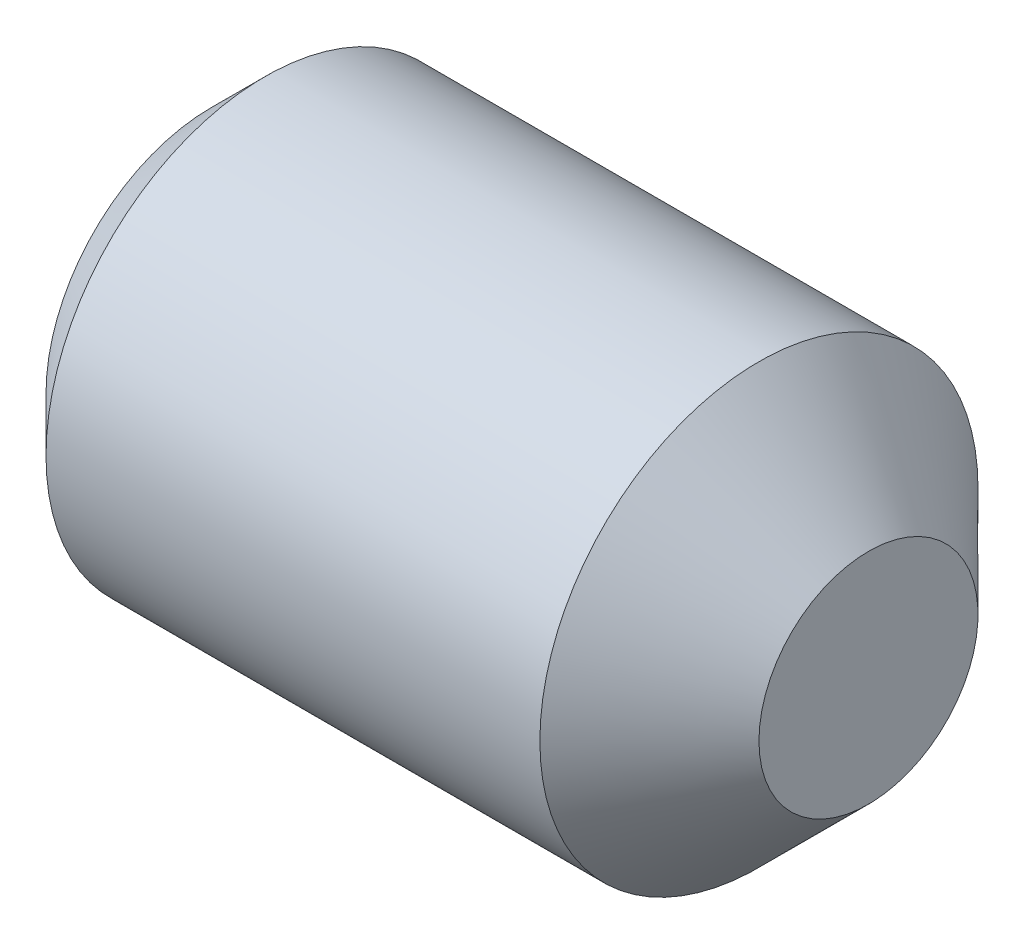
ISO-10303-21;
HEADER;
FILE_DESCRIPTION(('STEP AP214'),'2;1');
FILE_NAME('part.step','',(''),(''),'','','');
FILE_SCHEMA(('AUTOMOTIVE_DESIGN { 1 0 10303 214 1 1 1 1 }'));
ENDSEC;
DATA;
#1=APPLICATION_CONTEXT('core data for automotive mechanical design processes');
#2=APPLICATION_PROTOCOL_DEFINITION('international standard','automotive_design',2000,#1);
#3=PRODUCT_CONTEXT('',#1,'mechanical');
#4=PRODUCT('Part','Part','',(#3));
#5=PRODUCT_RELATED_PRODUCT_CATEGORY('part','',(#4));
#6=PRODUCT_DEFINITION_FORMATION('','',#4);
#7=PRODUCT_DEFINITION_CONTEXT('part definition',#1,'design');
#8=PRODUCT_DEFINITION('design','',#6,#7);
#9=PRODUCT_DEFINITION_SHAPE('','',#8);
#10=(LENGTH_UNIT() NAMED_UNIT(*) SI_UNIT(.MILLI.,.METRE.));
#11=(NAMED_UNIT(*) PLANE_ANGLE_UNIT() SI_UNIT($,.RADIAN.));
#12=(NAMED_UNIT(*) SI_UNIT($,.STERADIAN.) SOLID_ANGLE_UNIT());
#13=UNCERTAINTY_MEASURE_WITH_UNIT(LENGTH_MEASURE(1.E-05),#10,'distance_accuracy_value','');
#14=(GEOMETRIC_REPRESENTATION_CONTEXT(3) GLOBAL_UNCERTAINTY_ASSIGNED_CONTEXT((#13)) GLOBAL_UNIT_ASSIGNED_CONTEXT((#10,
#11,#12)) REPRESENTATION_CONTEXT('',''));
#15=CARTESIAN_POINT('',(0.,0.,0.));
#16=DIRECTION('',(0.,0.,1.));
#17=DIRECTION('',(1.,0.,0.));
#18=AXIS2_PLACEMENT_3D('',#15,#16,#17);
#19=CARTESIAN_POINT('',(-2.2,0.,0.));
#20=DIRECTION('',(-1.,0.,0.));
#21=DIRECTION('',(0.,0.,1.));
#22=AXIS2_PLACEMENT_3D('',#19,#20,#21);
#23=PLANE('',#22);
#24=CARTESIAN_POINT('',(-2.2,0.,0.));
#25=DIRECTION('',(-1.,0.,0.));
#26=DIRECTION('',(0.,0.,1.));
#27=AXIS2_PLACEMENT_3D('',#24,#25,#26);
#28=CIRCLE('',#27,0.45);
#29=CARTESIAN_POINT('',(-2.2,0.224999999999999,0.389711431702998));
#30=VERTEX_POINT('',#29);
#31=CARTESIAN_POINT('',(-2.2,0.45,0.));
#32=VERTEX_POINT('',#31);
#33=EDGE_CURVE('E44',#30,#32,#28,.T.);
#34=ORIENTED_EDGE('',*,*,#33,.F.);
#35=DIRECTION('',(0.,0.86602540378444,-0.499999999999998));
#36=VECTOR('',#35,1.);
#37=CARTESIAN_POINT('',(-2.2,0.,0.51961524227066));
#38=LINE('',#37,#36);
#39=CARTESIAN_POINT('',(-2.2,0.45,0.25980762113533));
#40=VERTEX_POINT('',#39);
#41=EDGE_CURVE('E223',#30,#40,#38,.T.);
#42=ORIENTED_EDGE('',*,*,#41,.T.);
#43=DIRECTION('',(0.,0.,-1.));
#44=VECTOR('',#43,1.);
#45=CARTESIAN_POINT('',(-2.2,0.45,0.25980762113533));
#46=LINE('',#45,#44);
#47=EDGE_CURVE('E216',#40,#32,#46,.T.);
#48=ORIENTED_EDGE('',*,*,#47,.T.);
#49=EDGE_LOOP('',(#34,#42,#48));
#50=FACE_BOUND('',#49,.T.);
#51=ADVANCED_FACE('F33',(#50),#23,.T.);
#52=CARTESIAN_POINT('',(-2.2,0.224999999999999,-0.389711431702998));
#53=VERTEX_POINT('',#52);
#54=EDGE_CURVE('E11',#32,#53,#28,.T.);
#55=ORIENTED_EDGE('',*,*,#54,.F.);
#56=CARTESIAN_POINT('',(-2.2,0.45,-0.25980762113533));
#57=VERTEX_POINT('',#56);
#58=EDGE_CURVE('E219',#32,#57,#46,.T.);
#59=ORIENTED_EDGE('',*,*,#58,.T.);
#60=DIRECTION('',(0.,-0.86602540378444,-0.499999999999998));
#61=VECTOR('',#60,1.);
#62=CARTESIAN_POINT('',(-2.2,0.45,-0.25980762113533));
#63=LINE('',#62,#61);
#64=EDGE_CURVE('E187',#57,#53,#63,.T.);
#65=ORIENTED_EDGE('',*,*,#64,.T.);
#66=EDGE_LOOP('',(#55,#59,#65));
#67=FACE_BOUND('',#66,.T.);
#68=ADVANCED_FACE('F120',(#67),#23,.T.);
#69=CARTESIAN_POINT('',(-2.2,-0.224999999999999,-0.389711431702998));
#70=VERTEX_POINT('',#69);
#71=EDGE_CURVE('E42',#53,#70,#28,.T.);
#72=ORIENTED_EDGE('',*,*,#71,.F.);
#73=CARTESIAN_POINT('',(-2.2,0.,-0.51961524227066));
#74=VERTEX_POINT('',#73);
#75=EDGE_CURVE('E215',#53,#74,#63,.T.);
#76=ORIENTED_EDGE('',*,*,#75,.T.);
#77=DIRECTION('',(0.,-0.86602540378444,0.499999999999998));
#78=VECTOR('',#77,1.);
#79=CARTESIAN_POINT('',(-2.2,0.,-0.51961524227066));
#80=LINE('',#79,#78);
#81=EDGE_CURVE('E232',#74,#70,#80,.T.);
#82=ORIENTED_EDGE('',*,*,#81,.T.);
#83=EDGE_LOOP('',(#72,#76,#82));
#84=FACE_BOUND('',#83,.T.);
#85=ADVANCED_FACE('F125',(#84),#23,.T.);
#86=CARTESIAN_POINT('',(-2.2,-0.45,0.));
#87=VERTEX_POINT('',#86);
#88=EDGE_CURVE('E235',#70,#87,#28,.T.);
#89=ORIENTED_EDGE('',*,*,#88,.F.);
#90=CARTESIAN_POINT('',(-2.2,-0.45,-0.25980762113533));
#91=VERTEX_POINT('',#90);
#92=EDGE_CURVE('E199',#70,#91,#80,.T.);
#93=ORIENTED_EDGE('',*,*,#92,.T.);
#94=DIRECTION('',(0.,0.,1.));
#95=VECTOR('',#94,1.);
#96=CARTESIAN_POINT('',(-2.2,-0.45,-0.25980762113533));
#97=LINE('',#96,#95);
#98=EDGE_CURVE('E228',#91,#87,#97,.T.);
#99=ORIENTED_EDGE('',*,*,#98,.T.);
#100=EDGE_LOOP('',(#89,#93,#99));
#101=FACE_BOUND('',#100,.T.);
#102=ADVANCED_FACE('F242',(#101),#23,.T.);
#103=CARTESIAN_POINT('',(-2.2,-0.224999999999998,0.389711431702996));
#104=VERTEX_POINT('',#103);
#105=EDGE_CURVE('E51',#87,#104,#28,.T.);
#106=ORIENTED_EDGE('',*,*,#105,.F.);
#107=CARTESIAN_POINT('',(-2.2,-0.45,0.25980762113533));
#108=VERTEX_POINT('',#107);
#109=EDGE_CURVE('E231',#87,#108,#97,.T.);
#110=ORIENTED_EDGE('',*,*,#109,.T.);
#111=DIRECTION('',(0.,0.86602540378444,0.499999999999998));
#112=VECTOR('',#111,1.);
#113=CARTESIAN_POINT('',(-2.2,-0.45,0.25980762113533));
#114=LINE('',#113,#112);
#115=EDGE_CURVE('E224',#108,#104,#114,.T.);
#116=ORIENTED_EDGE('',*,*,#115,.T.);
#117=EDGE_LOOP('',(#106,#110,#116));
#118=FACE_BOUND('',#117,.T.);
#119=ADVANCED_FACE('F118',(#118),#23,.T.);
#120=CARTESIAN_POINT('',(-3.,0.,0.));
#121=DIRECTION('',(1.,0.,0.));
#122=DIRECTION('',(0.,0.,-1.));
#123=AXIS2_PLACEMENT_3D('',#120,#121,#122);
#124=PLANE('',#123);
#125=DIRECTION('',(0.,0.,1.));
#126=VECTOR('',#125,1.);
#127=CARTESIAN_POINT('',(-3.,-0.45,-0.25980762113533));
#128=LINE('',#127,#126);
#129=CARTESIAN_POINT('',(-3.,-0.45,-0.25980762113533));
#130=VERTEX_POINT('',#129);
#131=CARTESIAN_POINT('',(-3.,-0.45,0.25980762113533));
#132=VERTEX_POINT('',#131);
#133=EDGE_CURVE('E209',#130,#132,#128,.T.);
#134=ORIENTED_EDGE('',*,*,#133,.F.);
#135=DIRECTION('',(0.,-0.86602540378444,0.499999999999998));
#136=VECTOR('',#135,1.);
#137=CARTESIAN_POINT('',(-3.,0.,-0.51961524227066));
#138=LINE('',#137,#136);
#139=CARTESIAN_POINT('',(-3.,0.,-0.51961524227066));
#140=VERTEX_POINT('',#139);
#141=EDGE_CURVE('E59',#140,#130,#138,.T.);
#142=ORIENTED_EDGE('',*,*,#141,.F.);
#143=DIRECTION('',(0.,-0.86602540378444,-0.499999999999998));
#144=VECTOR('',#143,1.);
#145=CARTESIAN_POINT('',(-3.,0.45,-0.25980762113533));
#146=LINE('',#145,#144);
#147=CARTESIAN_POINT('',(-3.,0.45,-0.25980762113533));
#148=VERTEX_POINT('',#147);
#149=EDGE_CURVE('E196',#148,#140,#146,.T.);
#150=ORIENTED_EDGE('',*,*,#149,.F.);
#151=DIRECTION('',(0.,0.,-1.));
#152=VECTOR('',#151,1.);
#153=CARTESIAN_POINT('',(-3.,0.45,0.25980762113533));
#154=LINE('',#153,#152);
#155=CARTESIAN_POINT('',(-3.,0.45,0.25980762113533));
#156=VERTEX_POINT('',#155);
#157=EDGE_CURVE('E200',#156,#148,#154,.T.);
#158=ORIENTED_EDGE('',*,*,#157,.F.);
#159=DIRECTION('',(0.,0.86602540378444,-0.499999999999998));
#160=VECTOR('',#159,1.);
#161=CARTESIAN_POINT('',(-3.,0.,0.51961524227066));
#162=LINE('',#161,#160);
#163=CARTESIAN_POINT('',(-3.,0.,0.51961524227066));
#164=VERTEX_POINT('',#163);
#165=EDGE_CURVE('E203',#164,#156,#162,.T.);
#166=ORIENTED_EDGE('',*,*,#165,.F.);
#167=DIRECTION('',(0.,0.86602540378444,0.499999999999998));
#168=VECTOR('',#167,1.);
#169=CARTESIAN_POINT('',(-3.,-0.45,0.25980762113533));
#170=LINE('',#169,#168);
#171=EDGE_CURVE('E206',#132,#164,#170,.T.);
#172=ORIENTED_EDGE('',*,*,#171,.F.);
#173=EDGE_LOOP('',(#134,#142,#150,#158,#166,#172));
#174=FACE_BOUND('',#173,.T.);
#175=CARTESIAN_POINT('',(-3.,0.,0.));
#176=DIRECTION('',(-1.,0.,0.));
#177=DIRECTION('',(0.,0.,1.));
#178=AXIS2_PLACEMENT_3D('',#175,#176,#177);
#179=CIRCLE('',#178,0.7545);
#180=CARTESIAN_POINT('',(-3.,0.,0.7545));
#181=VERTEX_POINT('',#180);
#182=EDGE_CURVE('E37',#181,#181,#179,.T.);
#183=ORIENTED_EDGE('',*,*,#182,.T.);
#184=EDGE_LOOP('',(#183));
#185=FACE_BOUND('',#184,.T.);
#186=ADVANCED_FACE('F35',(#174,#185),#124,.F.);
#187=CARTESIAN_POINT('',(-2.7545,0.,0.));
#188=DIRECTION('',(1.,0.,0.));
#189=DIRECTION('',(0.,0.,-1.));
#190=AXIS2_PLACEMENT_3D('',#187,#188,#189);
#191=CONICAL_SURFACE('',#190,1.,0.785398163397448);
#192=ORIENTED_EDGE('',*,*,#182,.F.);
#193=EDGE_LOOP('',(#192));
#194=FACE_BOUND('',#193,.T.);
#195=CARTESIAN_POINT('',(-2.7545,0.,0.));
#196=DIRECTION('',(-1.,0.,0.));
#197=DIRECTION('',(0.,0.,1.));
#198=AXIS2_PLACEMENT_3D('',#195,#196,#197);
#199=CIRCLE('',#198,1.);
#200=CARTESIAN_POINT('',(-2.7545,0.,1.));
#201=VERTEX_POINT('',#200);
#202=EDGE_CURVE('E174',#201,#201,#199,.T.);
#203=ORIENTED_EDGE('',*,*,#202,.T.);
#204=EDGE_LOOP('',(#203));
#205=FACE_BOUND('',#204,.T.);
#206=ADVANCED_FACE('F161',(#194,#205),#191,.T.);
#207=CARTESIAN_POINT('',(0.,0.,0.));
#208=DIRECTION('',(-1.,0.,0.));
#209=DIRECTION('',(0.,0.,1.));
#210=AXIS2_PLACEMENT_3D('',#207,#208,#209);
#211=CYLINDRICAL_SURFACE('',#210,1.);
#212=ORIENTED_EDGE('',*,*,#202,.F.);
#213=EDGE_LOOP('',(#212));
#214=FACE_BOUND('',#213,.T.);
#215=CARTESIAN_POINT('',(-0.5,0.,0.));
#216=DIRECTION('',(-1.,0.,0.));
#217=DIRECTION('',(0.,0.,1.));
#218=AXIS2_PLACEMENT_3D('',#215,#216,#217);
#219=CIRCLE('',#218,1.);
#220=CARTESIAN_POINT('',(-0.5,0.,1.));
#221=VERTEX_POINT('',#220);
#222=EDGE_CURVE('E175',#221,#221,#219,.T.);
#223=ORIENTED_EDGE('',*,*,#222,.T.);
#224=EDGE_LOOP('',(#223));
#225=FACE_BOUND('',#224,.T.);
#226=ADVANCED_FACE('F158',(#214,#225),#211,.T.);
#227=CARTESIAN_POINT('',(0.,0.,0.));
#228=DIRECTION('',(-1.,0.,0.));
#229=DIRECTION('',(0.,0.,1.));
#230=AXIS2_PLACEMENT_3D('',#227,#228,#229);
#231=CONICAL_SURFACE('',#230,0.5,0.785398163397448);
#232=ORIENTED_EDGE('',*,*,#222,.F.);
#233=EDGE_LOOP('',(#232));
#234=FACE_BOUND('',#233,.T.);
#235=CARTESIAN_POINT('',(0.,0.,0.));
#236=DIRECTION('',(-1.,0.,0.));
#237=DIRECTION('',(0.,0.,1.));
#238=AXIS2_PLACEMENT_3D('',#235,#236,#237);
#239=CIRCLE('',#238,0.5);
#240=CARTESIAN_POINT('',(0.,0.,0.5));
#241=VERTEX_POINT('',#240);
#242=EDGE_CURVE('E178',#241,#241,#239,.T.);
#243=ORIENTED_EDGE('',*,*,#242,.T.);
#244=EDGE_LOOP('',(#243));
#245=FACE_BOUND('',#244,.T.);
#246=ADVANCED_FACE('F154',(#234,#245),#231,.T.);
#247=CARTESIAN_POINT('',(0.,0.5,0.));
#248=DIRECTION('',(-1.,0.,0.));
#249=DIRECTION('',(0.,0.,1.));
#250=AXIS2_PLACEMENT_3D('',#247,#248,#249);
#251=PLANE('',#250);
#252=ORIENTED_EDGE('',*,*,#242,.F.);
#253=EDGE_LOOP('',(#252));
#254=FACE_BOUND('',#253,.T.);
#255=ADVANCED_FACE('F151',(#254),#251,.F.);
#256=CARTESIAN_POINT('',(-2.2,0.,-0.51961524227066));
#257=DIRECTION('',(0.,-0.499999999999998,-0.86602540378444));
#258=DIRECTION('',(0.,0.86602540378444,-0.499999999999998));
#259=AXIS2_PLACEMENT_3D('',#256,#257,#258);
#260=PLANE('',#259);
#261=ORIENTED_EDGE('',*,*,#141,.T.);
#262=DIRECTION('',(-1.,0.,0.));
#263=VECTOR('',#262,1.);
#264=CARTESIAN_POINT('',(-2.2,-0.45,-0.25980762113533));
#265=LINE('',#264,#263);
#266=EDGE_CURVE('E184',#91,#130,#265,.T.);
#267=ORIENTED_EDGE('',*,*,#266,.F.);
#268=ORIENTED_EDGE('',*,*,#92,.F.);
#269=ORIENTED_EDGE('',*,*,#81,.F.);
#270=DIRECTION('',(-1.,0.,0.));
#271=VECTOR('',#270,1.);
#272=CARTESIAN_POINT('',(-2.2,0.,-0.51961524227066));
#273=LINE('',#272,#271);
#274=EDGE_CURVE('E183',#74,#140,#273,.T.);
#275=ORIENTED_EDGE('',*,*,#274,.T.);
#276=EDGE_LOOP('',(#261,#267,#268,#269,#275));
#277=FACE_BOUND('',#276,.T.);
#278=ADVANCED_FACE('F133',(#277),#260,.F.);
#279=CARTESIAN_POINT('',(-2.2,0.45,-0.25980762113533));
#280=DIRECTION('',(0.,0.499999999999998,-0.86602540378444));
#281=DIRECTION('',(0.,0.86602540378444,0.499999999999998));
#282=AXIS2_PLACEMENT_3D('',#279,#280,#281);
#283=PLANE('',#282);
#284=ORIENTED_EDGE('',*,*,#149,.T.);
#285=ORIENTED_EDGE('',*,*,#274,.F.);
#286=ORIENTED_EDGE('',*,*,#75,.F.);
#287=ORIENTED_EDGE('',*,*,#64,.F.);
#288=DIRECTION('',(-1.,0.,0.));
#289=VECTOR('',#288,1.);
#290=CARTESIAN_POINT('',(-2.2,0.45,-0.25980762113533));
#291=LINE('',#290,#289);
#292=EDGE_CURVE('E193',#57,#148,#291,.T.);
#293=ORIENTED_EDGE('',*,*,#292,.T.);
#294=EDGE_LOOP('',(#284,#285,#286,#287,#293));
#295=FACE_BOUND('',#294,.T.);
#296=ADVANCED_FACE('F129',(#295),#283,.F.);
#297=CARTESIAN_POINT('',(-2.2,0.45,0.25980762113533));
#298=DIRECTION('',(0.,1.,0.));
#299=DIRECTION('',(0.,0.,1.));
#300=AXIS2_PLACEMENT_3D('',#297,#298,#299);
#301=PLANE('',#300);
#302=ORIENTED_EDGE('',*,*,#157,.T.);
#303=ORIENTED_EDGE('',*,*,#292,.F.);
#304=ORIENTED_EDGE('',*,*,#58,.F.);
#305=ORIENTED_EDGE('',*,*,#47,.F.);
#306=DIRECTION('',(-1.,0.,0.));
#307=VECTOR('',#306,1.);
#308=CARTESIAN_POINT('',(-2.2,0.45,0.25980762113533));
#309=LINE('',#308,#307);
#310=EDGE_CURVE('E191',#40,#156,#309,.T.);
#311=ORIENTED_EDGE('',*,*,#310,.T.);
#312=EDGE_LOOP('',(#302,#303,#304,#305,#311));
#313=FACE_BOUND('',#312,.T.);
#314=ADVANCED_FACE('F132',(#313),#301,.F.);
#315=CARTESIAN_POINT('',(-2.2,0.,0.51961524227066));
#316=DIRECTION('',(0.,0.499999999999998,0.86602540378444));
#317=DIRECTION('',(0.,-0.86602540378444,0.499999999999998));
#318=AXIS2_PLACEMENT_3D('',#315,#316,#317);
#319=PLANE('',#318);
#320=ORIENTED_EDGE('',*,*,#165,.T.);
#321=ORIENTED_EDGE('',*,*,#310,.F.);
#322=ORIENTED_EDGE('',*,*,#41,.F.);
#323=CARTESIAN_POINT('',(-2.2,0.,0.51961524227066));
#324=VERTEX_POINT('',#323);
#325=EDGE_CURVE('E220',#324,#30,#38,.T.);
#326=ORIENTED_EDGE('',*,*,#325,.F.);
#327=DIRECTION('',(-1.,0.,0.));
#328=VECTOR('',#327,1.);
#329=CARTESIAN_POINT('',(-2.2,0.,0.51961524227066));
#330=LINE('',#329,#328);
#331=EDGE_CURVE('E189',#324,#164,#330,.T.);
#332=ORIENTED_EDGE('',*,*,#331,.T.);
#333=EDGE_LOOP('',(#320,#321,#322,#326,#332));
#334=FACE_BOUND('',#333,.T.);
#335=ADVANCED_FACE('F137',(#334),#319,.F.);
#336=CARTESIAN_POINT('',(-2.2,-0.45,0.25980762113533));
#337=DIRECTION('',(0.,-0.499999999999998,0.86602540378444));
#338=DIRECTION('',(0.,-0.86602540378444,-0.499999999999998));
#339=AXIS2_PLACEMENT_3D('',#336,#337,#338);
#340=PLANE('',#339);
#341=ORIENTED_EDGE('',*,*,#171,.T.);
#342=ORIENTED_EDGE('',*,*,#331,.F.);
#343=EDGE_CURVE('E227',#104,#324,#114,.T.);
#344=ORIENTED_EDGE('',*,*,#343,.F.);
#345=ORIENTED_EDGE('',*,*,#115,.F.);
#346=DIRECTION('',(-1.,0.,0.));
#347=VECTOR('',#346,1.);
#348=CARTESIAN_POINT('',(-2.2,-0.45,0.25980762113533));
#349=LINE('',#348,#347);
#350=EDGE_CURVE('E186',#108,#132,#349,.T.);
#351=ORIENTED_EDGE('',*,*,#350,.T.);
#352=EDGE_LOOP('',(#341,#342,#344,#345,#351));
#353=FACE_BOUND('',#352,.T.);
#354=ADVANCED_FACE('F141',(#353),#340,.F.);
#355=CARTESIAN_POINT('',(-2.2,-0.45,-0.25980762113533));
#356=DIRECTION('',(0.,-1.,0.));
#357=DIRECTION('',(0.,0.,-1.));
#358=AXIS2_PLACEMENT_3D('',#355,#356,#357);
#359=PLANE('',#358);
#360=ORIENTED_EDGE('',*,*,#133,.T.);
#361=ORIENTED_EDGE('',*,*,#350,.F.);
#362=ORIENTED_EDGE('',*,*,#109,.F.);
#363=ORIENTED_EDGE('',*,*,#98,.F.);
#364=ORIENTED_EDGE('',*,*,#266,.T.);
#365=EDGE_LOOP('',(#360,#361,#362,#363,#364));
#366=FACE_BOUND('',#365,.T.);
#367=ADVANCED_FACE('F115',(#366),#359,.F.);
#368=EDGE_CURVE('E176',#104,#30,#28,.T.);
#369=ORIENTED_EDGE('',*,*,#368,.F.);
#370=ORIENTED_EDGE('',*,*,#343,.T.);
#371=ORIENTED_EDGE('',*,*,#325,.T.);
#372=EDGE_LOOP('',(#369,#370,#371));
#373=FACE_BOUND('',#372,.T.);
#374=ADVANCED_FACE('F110',(#373),#23,.T.);
#375=CARTESIAN_POINT('',(-1.9401923788647,0.,0.));
#376=DIRECTION('',(-1.,0.,0.));
#377=DIRECTION('',(0.,0.,1.));
#378=AXIS2_PLACEMENT_3D('',#375,#376,#377);
#379=CONICAL_SURFACE('',#378,0.,1.04719755119665);
#380=ORIENTED_EDGE('',*,*,#33,.T.);
#381=ORIENTED_EDGE('',*,*,#54,.T.);
#382=ORIENTED_EDGE('',*,*,#71,.T.);
#383=ORIENTED_EDGE('',*,*,#88,.T.);
#384=ORIENTED_EDGE('',*,*,#105,.T.);
#385=ORIENTED_EDGE('',*,*,#368,.T.);
#386=EDGE_LOOP('',(#380,#381,#382,#383,#384,#385));
#387=FACE_BOUND('',#386,.T.);
#388=CARTESIAN_POINT('',(-1.9401923788647,0.,0.));
#389=VERTEX_POINT('',#388);
#390=VERTEX_LOOP('',#389);
#391=FACE_BOUND('',#390,.T.);
#392=ADVANCED_FACE('F108',(#387,#391),#379,.F.);
#393=CLOSED_SHELL('',(#51,#68,#85,#102,#119,#186,#206,#226,#246,#255,#278,#296,#314,#335,#354,
#367,#374,#392));
#394=MANIFOLD_SOLID_BREP('B2',#393);
#395=ADVANCED_BREP_SHAPE_REPRESENTATION('',(#18,#394),#14);
#396=SHAPE_DEFINITION_REPRESENTATION(#9,#395);
ENDSEC;
END-ISO-10303-21;
